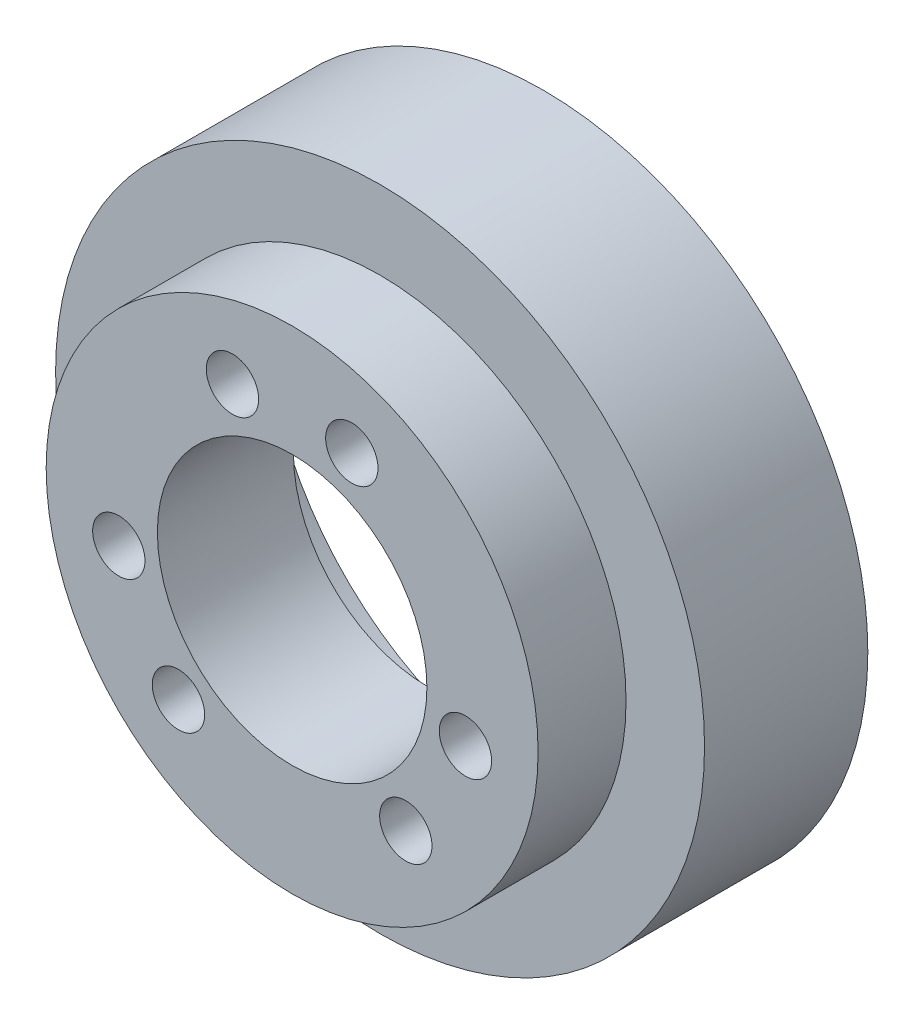
ISO-10303-21;
HEADER;
FILE_DESCRIPTION(('STEP AP214'),'2;1');
FILE_NAME('part.step','',(''),(''),'','','');
FILE_SCHEMA(('AUTOMOTIVE_DESIGN { 1 0 10303 214 1 1 1 1 }'));
ENDSEC;
DATA;
#1=APPLICATION_CONTEXT('core data for automotive mechanical design processes');
#2=APPLICATION_PROTOCOL_DEFINITION('international standard','automotive_design',2000,#1);
#3=PRODUCT_CONTEXT('',#1,'mechanical');
#4=PRODUCT('Part','Part','',(#3));
#5=PRODUCT_RELATED_PRODUCT_CATEGORY('part','',(#4));
#6=PRODUCT_DEFINITION_FORMATION('','',#4);
#7=PRODUCT_DEFINITION_CONTEXT('part definition',#1,'design');
#8=PRODUCT_DEFINITION('design','',#6,#7);
#9=PRODUCT_DEFINITION_SHAPE('','',#8);
#10=(LENGTH_UNIT() NAMED_UNIT(*) SI_UNIT(.MILLI.,.METRE.));
#11=(NAMED_UNIT(*) PLANE_ANGLE_UNIT() SI_UNIT($,.RADIAN.));
#12=(NAMED_UNIT(*) SI_UNIT($,.STERADIAN.) SOLID_ANGLE_UNIT());
#13=UNCERTAINTY_MEASURE_WITH_UNIT(LENGTH_MEASURE(1.E-05),#10,'distance_accuracy_value','');
#14=(GEOMETRIC_REPRESENTATION_CONTEXT(3) GLOBAL_UNCERTAINTY_ASSIGNED_CONTEXT((#13)) GLOBAL_UNIT_ASSIGNED_CONTEXT((#10,
#11,#12)) REPRESENTATION_CONTEXT('',''));
#15=CARTESIAN_POINT('',(0.,0.,0.));
#16=DIRECTION('',(0.,0.,1.));
#17=DIRECTION('',(1.,0.,0.));
#18=AXIS2_PLACEMENT_3D('',#15,#16,#17);
#19=CARTESIAN_POINT('',(0.,0.,0.));
#20=DIRECTION('',(0.,0.,1.));
#21=DIRECTION('',(1.,0.,0.));
#22=AXIS2_PLACEMENT_3D('',#19,#20,#21);
#23=CYLINDRICAL_SURFACE('',#22,12.875);
#24=CARTESIAN_POINT('',(0.,0.,24.));
#25=DIRECTION('',(0.,0.,1.));
#26=DIRECTION('',(1.,0.,0.));
#27=AXIS2_PLACEMENT_3D('',#24,#25,#26);
#28=CIRCLE('',#27,12.875);
#29=CARTESIAN_POINT('',(12.875,0.,24.));
#30=VERTEX_POINT('',#29);
#31=EDGE_CURVE('E56',#30,#30,#28,.T.);
#32=ORIENTED_EDGE('',*,*,#31,.T.);
#33=EDGE_LOOP('',(#32));
#34=FACE_BOUND('',#33,.T.);
#35=CARTESIAN_POINT('',(0.,0.,11.));
#36=DIRECTION('',(0.,0.,-1.));
#37=DIRECTION('',(-1.,0.,0.));
#38=AXIS2_PLACEMENT_3D('',#35,#36,#37);
#39=CIRCLE('',#38,12.875);
#40=CARTESIAN_POINT('',(-12.875,0.,11.));
#41=VERTEX_POINT('',#40);
#42=EDGE_CURVE('E63',#41,#41,#39,.F.);
#43=ORIENTED_EDGE('',*,*,#42,.F.);
#44=EDGE_LOOP('',(#43));
#45=FACE_BOUND('',#44,.T.);
#46=ADVANCED_FACE('F39',(#34,#45),#23,.F.);
#47=CARTESIAN_POINT('',(0.,0.,15.6));
#48=DIRECTION('',(0.,0.,-1.));
#49=DIRECTION('',(-1.,0.,0.));
#50=AXIS2_PLACEMENT_3D('',#47,#48,#49);
#51=CYLINDRICAL_SURFACE('',#50,31.);
#52=CARTESIAN_POINT('',(0.,0.,15.6));
#53=DIRECTION('',(0.,0.,1.));
#54=DIRECTION('',(1.,0.,0.));
#55=AXIS2_PLACEMENT_3D('',#52,#53,#54);
#56=CIRCLE('',#55,31.);
#57=CARTESIAN_POINT('',(31.,0.,15.6));
#58=VERTEX_POINT('',#57);
#59=EDGE_CURVE('E47',#58,#58,#56,.T.);
#60=ORIENTED_EDGE('',*,*,#59,.F.);
#61=EDGE_LOOP('',(#60));
#62=FACE_BOUND('',#61,.T.);
#63=CARTESIAN_POINT('',(0.,0.,0.));
#64=DIRECTION('',(0.,0.,1.));
#65=DIRECTION('',(1.,0.,0.));
#66=AXIS2_PLACEMENT_3D('',#63,#64,#65);
#67=CIRCLE('',#66,31.);
#68=CARTESIAN_POINT('',(31.,0.,0.));
#69=VERTEX_POINT('',#68);
#70=EDGE_CURVE('E52',#69,#69,#67,.T.);
#71=ORIENTED_EDGE('',*,*,#70,.T.);
#72=EDGE_LOOP('',(#71));
#73=FACE_BOUND('',#72,.T.);
#74=ADVANCED_FACE('F41',(#62,#73),#51,.T.);
#75=CARTESIAN_POINT('',(0.,0.,15.6));
#76=DIRECTION('',(0.,0.,1.));
#77=DIRECTION('',(1.,0.,0.));
#78=AXIS2_PLACEMENT_3D('',#75,#76,#77);
#79=PLANE('',#78);
#80=CARTESIAN_POINT('',(0.,0.,15.6));
#81=DIRECTION('',(0.,0.,1.));
#82=DIRECTION('',(1.,0.,0.));
#83=AXIS2_PLACEMENT_3D('',#80,#81,#82);
#84=CIRCLE('',#83,23.5);
#85=CARTESIAN_POINT('',(23.5,0.,15.6));
#86=VERTEX_POINT('',#85);
#87=EDGE_CURVE('E11',#86,#86,#84,.T.);
#88=ORIENTED_EDGE('',*,*,#87,.F.);
#89=EDGE_LOOP('',(#88));
#90=FACE_BOUND('',#89,.T.);
#91=ORIENTED_EDGE('',*,*,#59,.T.);
#92=EDGE_LOOP('',(#91));
#93=FACE_BOUND('',#92,.T.);
#94=ADVANCED_FACE('F98',(#90,#93),#79,.T.);
#95=CARTESIAN_POINT('',(0.,0.,0.));
#96=DIRECTION('',(0.,0.,1.));
#97=DIRECTION('',(1.,0.,0.));
#98=AXIS2_PLACEMENT_3D('',#95,#96,#97);
#99=PLANE('',#98);
#100=CARTESIAN_POINT('',(0.,0.,0.));
#101=DIRECTION('',(0.,0.,-1.));
#102=DIRECTION('',(-1.,0.,0.));
#103=AXIS2_PLACEMENT_3D('',#100,#101,#102);
#104=CIRCLE('',#103,26.625);
#105=CARTESIAN_POINT('',(-26.625,0.,0.));
#106=VERTEX_POINT('',#105);
#107=EDGE_CURVE('E69',#106,#106,#104,.T.);
#108=ORIENTED_EDGE('',*,*,#107,.F.);
#109=EDGE_LOOP('',(#108));
#110=FACE_BOUND('',#109,.T.);
#111=ORIENTED_EDGE('',*,*,#70,.F.);
#112=EDGE_LOOP('',(#111));
#113=FACE_BOUND('',#112,.T.);
#114=ADVANCED_FACE('F94',(#110,#113),#99,.F.);
#115=CARTESIAN_POINT('',(0.,0.,114.468037431535));
#116=DIRECTION('',(0.,0.,-1.));
#117=DIRECTION('',(-1.,0.,0.));
#118=AXIS2_PLACEMENT_3D('',#115,#116,#117);
#119=CYLINDRICAL_SURFACE('',#118,23.5);
#120=ORIENTED_EDGE('',*,*,#87,.T.);
#121=EDGE_LOOP('',(#120));
#122=FACE_BOUND('',#121,.T.);
#123=CARTESIAN_POINT('',(0.,0.,24.));
#124=DIRECTION('',(0.,0.,1.));
#125=DIRECTION('',(1.,0.,0.));
#126=AXIS2_PLACEMENT_3D('',#123,#124,#125);
#127=CIRCLE('',#126,23.5);
#128=CARTESIAN_POINT('',(23.5,0.,24.));
#129=VERTEX_POINT('',#128);
#130=EDGE_CURVE('E58',#129,#129,#127,.T.);
#131=ORIENTED_EDGE('',*,*,#130,.F.);
#132=EDGE_LOOP('',(#131));
#133=FACE_BOUND('',#132,.T.);
#134=ADVANCED_FACE('F97',(#122,#133),#119,.T.);
#135=CARTESIAN_POINT('',(0.,0.,24.));
#136=DIRECTION('',(0.,0.,1.));
#137=DIRECTION('',(1.,0.,0.));
#138=AXIS2_PLACEMENT_3D('',#135,#136,#137);
#139=PLANE('',#138);
#140=CARTESIAN_POINT('',(-10.8592293273547,-12.8513720441017,24.));
#141=DIRECTION('',(0.,0.,1.));
#142=DIRECTION('',(1.,0.,0.));
#143=AXIS2_PLACEMENT_3D('',#140,#141,#142);
#144=CIRCLE('',#143,2.49999999999999);
#145=CARTESIAN_POINT('',(-8.35922932735475,-12.8513720441017,24.));
#146=VERTEX_POINT('',#145);
#147=EDGE_CURVE('E133',#146,#146,#144,.T.);
#148=ORIENTED_EDGE('',*,*,#147,.F.);
#149=EDGE_LOOP('',(#148));
#150=FACE_BOUND('',#149,.T.);
#151=CARTESIAN_POINT('',(-16.5592293273546,-2.97868244095905,24.));
#152=DIRECTION('',(0.,0.,1.));
#153=DIRECTION('',(1.,0.,0.));
#154=AXIS2_PLACEMENT_3D('',#151,#152,#153);
#155=CIRCLE('',#154,2.49999999999999);
#156=CARTESIAN_POINT('',(-14.0592293273547,-2.97868244095905,24.));
#157=VERTEX_POINT('',#156);
#158=EDGE_CURVE('E137',#157,#157,#155,.T.);
#159=ORIENTED_EDGE('',*,*,#158,.F.);
#160=EDGE_LOOP('',(#159));
#161=FACE_BOUND('',#160,.T.);
#162=CARTESIAN_POINT('',(16.5592293273546,-2.97868244095928,24.));
#163=DIRECTION('',(0.,0.,1.));
#164=DIRECTION('',(1.,0.,0.));
#165=AXIS2_PLACEMENT_3D('',#162,#163,#164);
#166=CIRCLE('',#165,2.49999999999999);
#167=CARTESIAN_POINT('',(19.0592293273546,-2.97868244095928,24.));
#168=VERTEX_POINT('',#167);
#169=EDGE_CURVE('E141',#168,#168,#166,.T.);
#170=ORIENTED_EDGE('',*,*,#169,.F.);
#171=EDGE_LOOP('',(#170));
#172=FACE_BOUND('',#171,.T.);
#173=CARTESIAN_POINT('',(10.8592293273546,-12.8513720441019,24.));
#174=DIRECTION('',(0.,0.,1.));
#175=DIRECTION('',(1.,0.,0.));
#176=AXIS2_PLACEMENT_3D('',#173,#174,#175);
#177=CIRCLE('',#176,2.49999999999999);
#178=CARTESIAN_POINT('',(13.3592293273546,-12.8513720441019,24.));
#179=VERTEX_POINT('',#178);
#180=EDGE_CURVE('E84',#179,#179,#177,.T.);
#181=ORIENTED_EDGE('',*,*,#180,.F.);
#182=EDGE_LOOP('',(#181));
#183=FACE_BOUND('',#182,.T.);
#184=CARTESIAN_POINT('',(-5.7,15.830054485061,24.));
#185=DIRECTION('',(0.,0.,1.));
#186=DIRECTION('',(1.,0.,0.));
#187=AXIS2_PLACEMENT_3D('',#184,#185,#186);
#188=CIRCLE('',#187,2.49999999999999);
#189=CARTESIAN_POINT('',(-3.20000000000001,15.830054485061,24.));
#190=VERTEX_POINT('',#189);
#191=EDGE_CURVE('E73',#190,#190,#188,.T.);
#192=ORIENTED_EDGE('',*,*,#191,.F.);
#193=EDGE_LOOP('',(#192));
#194=FACE_BOUND('',#193,.T.);
#195=CARTESIAN_POINT('',(5.7,15.830054485061,24.));
#196=DIRECTION('',(0.,0.,1.));
#197=DIRECTION('',(1.,0.,0.));
#198=AXIS2_PLACEMENT_3D('',#195,#196,#197);
#199=CIRCLE('',#198,2.49999999999999);
#200=CARTESIAN_POINT('',(8.19999999999999,15.830054485061,24.));
#201=VERTEX_POINT('',#200);
#202=EDGE_CURVE('E70',#201,#201,#199,.T.);
#203=ORIENTED_EDGE('',*,*,#202,.F.);
#204=EDGE_LOOP('',(#203));
#205=FACE_BOUND('',#204,.T.);
#206=ORIENTED_EDGE('',*,*,#31,.F.);
#207=EDGE_LOOP('',(#206));
#208=FACE_BOUND('',#207,.T.);
#209=ORIENTED_EDGE('',*,*,#130,.T.);
#210=EDGE_LOOP('',(#209));
#211=FACE_BOUND('',#210,.T.);
#212=ADVANCED_FACE('F122',(#150,#161,#172,#183,#194,#205,#208,#211),#139,.T.);
#213=CARTESIAN_POINT('',(0.,0.,11.));
#214=DIRECTION('',(0.,0.,-1.));
#215=DIRECTION('',(-1.,0.,0.));
#216=AXIS2_PLACEMENT_3D('',#213,#214,#215);
#217=PLANE('',#216);
#218=CARTESIAN_POINT('',(-10.8592293273547,-12.8513720441017,11.));
#219=DIRECTION('',(0.,0.,-1.));
#220=DIRECTION('',(-1.,0.,0.));
#221=AXIS2_PLACEMENT_3D('',#218,#219,#220);
#222=CIRCLE('',#221,2.49999999999999);
#223=CARTESIAN_POINT('',(-13.3592293273547,-12.8513720441017,11.));
#224=VERTEX_POINT('',#223);
#225=EDGE_CURVE('E185',#224,#224,#222,.T.);
#226=ORIENTED_EDGE('',*,*,#225,.F.);
#227=EDGE_LOOP('',(#226));
#228=FACE_BOUND('',#227,.T.);
#229=CARTESIAN_POINT('',(-16.5592293273546,-2.97868244095905,11.));
#230=DIRECTION('',(0.,0.,-1.));
#231=DIRECTION('',(-1.,0.,0.));
#232=AXIS2_PLACEMENT_3D('',#229,#230,#231);
#233=CIRCLE('',#232,2.49999999999999);
#234=CARTESIAN_POINT('',(-19.0592293273546,-2.97868244095905,11.));
#235=VERTEX_POINT('',#234);
#236=EDGE_CURVE('E43',#235,#235,#233,.T.);
#237=ORIENTED_EDGE('',*,*,#236,.F.);
#238=EDGE_LOOP('',(#237));
#239=FACE_BOUND('',#238,.T.);
#240=CARTESIAN_POINT('',(16.5592293273546,-2.97868244095928,11.));
#241=DIRECTION('',(0.,0.,-1.));
#242=DIRECTION('',(-1.,0.,0.));
#243=AXIS2_PLACEMENT_3D('',#240,#241,#242);
#244=CIRCLE('',#243,2.49999999999999);
#245=CARTESIAN_POINT('',(14.0592293273546,-2.97868244095928,11.));
#246=VERTEX_POINT('',#245);
#247=EDGE_CURVE('E191',#246,#246,#244,.T.);
#248=ORIENTED_EDGE('',*,*,#247,.F.);
#249=EDGE_LOOP('',(#248));
#250=FACE_BOUND('',#249,.T.);
#251=CARTESIAN_POINT('',(10.8592293273546,-12.8513720441019,11.));
#252=DIRECTION('',(0.,0.,-1.));
#253=DIRECTION('',(-1.,0.,0.));
#254=AXIS2_PLACEMENT_3D('',#251,#252,#253);
#255=CIRCLE('',#254,2.49999999999999);
#256=CARTESIAN_POINT('',(8.35922932735457,-12.8513720441019,11.));
#257=VERTEX_POINT('',#256);
#258=EDGE_CURVE('E79',#257,#257,#255,.T.);
#259=ORIENTED_EDGE('',*,*,#258,.F.);
#260=EDGE_LOOP('',(#259));
#261=FACE_BOUND('',#260,.T.);
#262=CARTESIAN_POINT('',(-5.7,15.830054485061,11.));
#263=DIRECTION('',(0.,0.,-1.));
#264=DIRECTION('',(-1.,0.,0.));
#265=AXIS2_PLACEMENT_3D('',#262,#263,#264);
#266=CIRCLE('',#265,2.49999999999999);
#267=CARTESIAN_POINT('',(-8.19999999999999,15.830054485061,11.));
#268=VERTEX_POINT('',#267);
#269=EDGE_CURVE('E71',#268,#268,#266,.T.);
#270=ORIENTED_EDGE('',*,*,#269,.F.);
#271=EDGE_LOOP('',(#270));
#272=FACE_BOUND('',#271,.T.);
#273=CARTESIAN_POINT('',(5.7,15.830054485061,11.));
#274=DIRECTION('',(0.,0.,-1.));
#275=DIRECTION('',(-1.,0.,0.));
#276=AXIS2_PLACEMENT_3D('',#273,#274,#275);
#277=CIRCLE('',#276,2.49999999999999);
#278=CARTESIAN_POINT('',(3.20000000000001,15.830054485061,11.));
#279=VERTEX_POINT('',#278);
#280=EDGE_CURVE('E67',#279,#279,#277,.T.);
#281=ORIENTED_EDGE('',*,*,#280,.F.);
#282=EDGE_LOOP('',(#281));
#283=FACE_BOUND('',#282,.T.);
#284=CARTESIAN_POINT('',(0.,0.,11.));
#285=DIRECTION('',(0.,0.,-1.));
#286=DIRECTION('',(-1.,0.,0.));
#287=AXIS2_PLACEMENT_3D('',#284,#285,#286);
#288=CIRCLE('',#287,26.625);
#289=CARTESIAN_POINT('',(-26.625,0.,11.));
#290=VERTEX_POINT('',#289);
#291=EDGE_CURVE('E66',#290,#290,#288,.T.);
#292=ORIENTED_EDGE('',*,*,#291,.T.);
#293=EDGE_LOOP('',(#292));
#294=FACE_BOUND('',#293,.T.);
#295=ORIENTED_EDGE('',*,*,#42,.T.);
#296=EDGE_LOOP('',(#295));
#297=FACE_BOUND('',#296,.T.);
#298=ADVANCED_FACE('F124',(#228,#239,#250,#261,#272,#283,#294,#297),#217,.T.);
#299=CARTESIAN_POINT('',(0.,0.,11.));
#300=DIRECTION('',(0.,0.,-1.));
#301=DIRECTION('',(-1.,0.,0.));
#302=AXIS2_PLACEMENT_3D('',#299,#300,#301);
#303=CYLINDRICAL_SURFACE('',#302,26.625);
#304=ORIENTED_EDGE('',*,*,#291,.F.);
#305=EDGE_LOOP('',(#304));
#306=FACE_BOUND('',#305,.T.);
#307=ORIENTED_EDGE('',*,*,#107,.T.);
#308=EDGE_LOOP('',(#307));
#309=FACE_BOUND('',#308,.T.);
#310=ADVANCED_FACE('F92',(#306,#309),#303,.F.);
#311=CARTESIAN_POINT('',(5.7,15.830054485061,24.));
#312=DIRECTION('',(0.,0.,1.));
#313=DIRECTION('',(1.,0.,0.));
#314=AXIS2_PLACEMENT_3D('',#311,#312,#313);
#315=CYLINDRICAL_SURFACE('',#314,2.49999999999999);
#316=ORIENTED_EDGE('',*,*,#280,.T.);
#317=EDGE_LOOP('',(#316));
#318=FACE_BOUND('',#317,.T.);
#319=ORIENTED_EDGE('',*,*,#202,.T.);
#320=EDGE_LOOP('',(#319));
#321=FACE_BOUND('',#320,.T.);
#322=ADVANCED_FACE('F153',(#318,#321),#315,.F.);
#323=CARTESIAN_POINT('',(-5.7,15.830054485061,24.));
#324=DIRECTION('',(0.,0.,1.));
#325=DIRECTION('',(1.,0.,0.));
#326=AXIS2_PLACEMENT_3D('',#323,#324,#325);
#327=CYLINDRICAL_SURFACE('',#326,2.49999999999999);
#328=ORIENTED_EDGE('',*,*,#269,.T.);
#329=EDGE_LOOP('',(#328));
#330=FACE_BOUND('',#329,.T.);
#331=ORIENTED_EDGE('',*,*,#191,.T.);
#332=EDGE_LOOP('',(#331));
#333=FACE_BOUND('',#332,.T.);
#334=ADVANCED_FACE('F155',(#330,#333),#327,.F.);
#335=CARTESIAN_POINT('',(10.8592293273546,-12.8513720441019,24.));
#336=DIRECTION('',(0.,0.,1.));
#337=DIRECTION('',(1.,0.,0.));
#338=AXIS2_PLACEMENT_3D('',#335,#336,#337);
#339=CYLINDRICAL_SURFACE('',#338,2.49999999999999);
#340=ORIENTED_EDGE('',*,*,#258,.T.);
#341=EDGE_LOOP('',(#340));
#342=FACE_BOUND('',#341,.T.);
#343=ORIENTED_EDGE('',*,*,#180,.T.);
#344=EDGE_LOOP('',(#343));
#345=FACE_BOUND('',#344,.T.);
#346=ADVANCED_FACE('F162',(#342,#345),#339,.F.);
#347=CARTESIAN_POINT('',(16.5592293273546,-2.97868244095928,24.));
#348=DIRECTION('',(0.,0.,1.));
#349=DIRECTION('',(1.,0.,0.));
#350=AXIS2_PLACEMENT_3D('',#347,#348,#349);
#351=CYLINDRICAL_SURFACE('',#350,2.49999999999999);
#352=ORIENTED_EDGE('',*,*,#247,.T.);
#353=EDGE_LOOP('',(#352));
#354=FACE_BOUND('',#353,.T.);
#355=ORIENTED_EDGE('',*,*,#169,.T.);
#356=EDGE_LOOP('',(#355));
#357=FACE_BOUND('',#356,.T.);
#358=ADVANCED_FACE('F168',(#354,#357),#351,.F.);
#359=CARTESIAN_POINT('',(-16.5592293273546,-2.97868244095905,24.));
#360=DIRECTION('',(0.,0.,1.));
#361=DIRECTION('',(1.,0.,0.));
#362=AXIS2_PLACEMENT_3D('',#359,#360,#361);
#363=CYLINDRICAL_SURFACE('',#362,2.49999999999999);
#364=ORIENTED_EDGE('',*,*,#236,.T.);
#365=EDGE_LOOP('',(#364));
#366=FACE_BOUND('',#365,.T.);
#367=ORIENTED_EDGE('',*,*,#158,.T.);
#368=EDGE_LOOP('',(#367));
#369=FACE_BOUND('',#368,.T.);
#370=ADVANCED_FACE('F172',(#366,#369),#363,.F.);
#371=CARTESIAN_POINT('',(-10.8592293273547,-12.8513720441017,24.));
#372=DIRECTION('',(0.,0.,1.));
#373=DIRECTION('',(1.,0.,0.));
#374=AXIS2_PLACEMENT_3D('',#371,#372,#373);
#375=CYLINDRICAL_SURFACE('',#374,2.49999999999999);
#376=ORIENTED_EDGE('',*,*,#225,.T.);
#377=EDGE_LOOP('',(#376));
#378=FACE_BOUND('',#377,.T.);
#379=ORIENTED_EDGE('',*,*,#147,.T.);
#380=EDGE_LOOP('',(#379));
#381=FACE_BOUND('',#380,.T.);
#382=ADVANCED_FACE('F176',(#378,#381),#375,.F.);
#383=CLOSED_SHELL('',(#46,#74,#94,#114,#134,#212,#298,#310,#322,#334,#346,#358,#370,#382));
#384=MANIFOLD_SOLID_BREP('B2',#383);
#385=ADVANCED_BREP_SHAPE_REPRESENTATION('',(#18,#384),#14);
#386=SHAPE_DEFINITION_REPRESENTATION(#9,#385);
ENDSEC;
END-ISO-10303-21;
